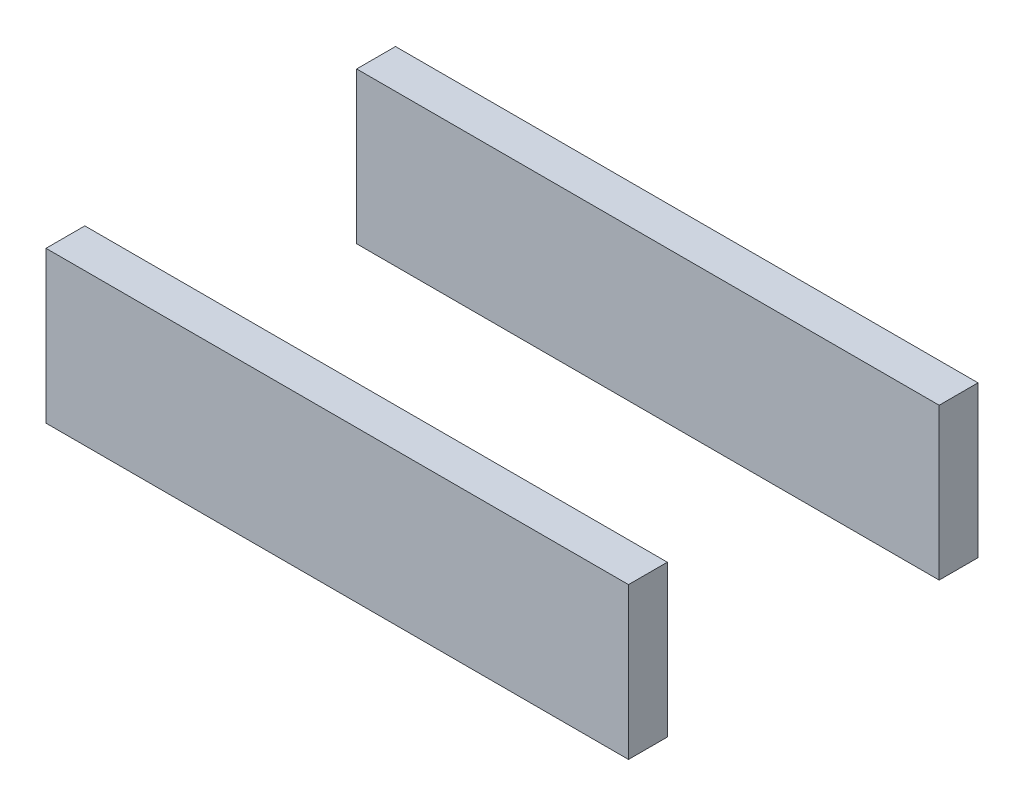
ISO-10303-21;
HEADER;
FILE_DESCRIPTION(('STEP AP214'),'2;1');
FILE_NAME('part.step','',(''),(''),'','','');
FILE_SCHEMA(('AUTOMOTIVE_DESIGN { 1 0 10303 214 1 1 1 1 }'));
ENDSEC;
DATA;
#1=APPLICATION_CONTEXT('core data for automotive mechanical design processes');
#2=APPLICATION_PROTOCOL_DEFINITION('international standard','automotive_design',2000,#1);
#3=PRODUCT_CONTEXT('',#1,'mechanical');
#4=PRODUCT('Part','Part','',(#3));
#5=PRODUCT_RELATED_PRODUCT_CATEGORY('part','',(#4));
#6=PRODUCT_DEFINITION_FORMATION('','',#4);
#7=PRODUCT_DEFINITION_CONTEXT('part definition',#1,'design');
#8=PRODUCT_DEFINITION('design','',#6,#7);
#9=PRODUCT_DEFINITION_SHAPE('','',#8);
#10=(LENGTH_UNIT() NAMED_UNIT(*) SI_UNIT(.MILLI.,.METRE.));
#11=(NAMED_UNIT(*) PLANE_ANGLE_UNIT() SI_UNIT($,.RADIAN.));
#12=(NAMED_UNIT(*) SI_UNIT($,.STERADIAN.) SOLID_ANGLE_UNIT());
#13=UNCERTAINTY_MEASURE_WITH_UNIT(LENGTH_MEASURE(1.E-05),#10,'distance_accuracy_value','');
#14=(GEOMETRIC_REPRESENTATION_CONTEXT(3) GLOBAL_UNCERTAINTY_ASSIGNED_CONTEXT((#13)) GLOBAL_UNIT_ASSIGNED_CONTEXT((#10,
#11,#12)) REPRESENTATION_CONTEXT('',''));
#15=CARTESIAN_POINT('',(0.,0.,0.));
#16=DIRECTION('',(0.,0.,1.));
#17=DIRECTION('',(1.,0.,0.));
#18=AXIS2_PLACEMENT_3D('',#15,#16,#17);
#19=CARTESIAN_POINT('',(-25.5693333333333,9.906,-17.018));
#20=DIRECTION('',(1.,0.,0.));
#21=DIRECTION('',(0.,0.,-1.));
#22=AXIS2_PLACEMENT_3D('',#19,#20,#21);
#23=PLANE('',#22);
#24=DIRECTION('',(0.,0.,1.));
#25=VECTOR('',#24,1.);
#26=CARTESIAN_POINT('',(-25.5693333333333,0.,-17.018));
#27=LINE('',#26,#25);
#28=CARTESIAN_POINT('',(-25.5693333333333,0.,-17.018));
#29=VERTEX_POINT('',#28);
#30=CARTESIAN_POINT('',(-25.5693333333333,0.,-14.478));
#31=VERTEX_POINT('',#30);
#32=EDGE_CURVE('E106',#29,#31,#27,.T.);
#33=ORIENTED_EDGE('',*,*,#32,.T.);
#34=DIRECTION('',(0.,-1.,0.));
#35=VECTOR('',#34,1.);
#36=CARTESIAN_POINT('',(-25.5693333333333,9.906,-14.478));
#37=LINE('',#36,#35);
#38=CARTESIAN_POINT('',(-25.5693333333333,9.906,-14.478));
#39=VERTEX_POINT('',#38);
#40=EDGE_CURVE('E12',#39,#31,#37,.T.);
#41=ORIENTED_EDGE('',*,*,#40,.F.);
#42=DIRECTION('',(0.,0.,1.));
#43=VECTOR('',#42,1.);
#44=CARTESIAN_POINT('',(-25.5693333333333,9.906,-17.018));
#45=LINE('',#44,#43);
#46=CARTESIAN_POINT('',(-25.5693333333333,9.906,-17.018));
#47=VERTEX_POINT('',#46);
#48=EDGE_CURVE('E94',#47,#39,#45,.T.);
#49=ORIENTED_EDGE('',*,*,#48,.F.);
#50=DIRECTION('',(0.,-1.,0.));
#51=VECTOR('',#50,1.);
#52=CARTESIAN_POINT('',(-25.5693333333333,9.906,-17.018));
#53=LINE('',#52,#51);
#54=EDGE_CURVE('E102',#47,#29,#53,.T.);
#55=ORIENTED_EDGE('',*,*,#54,.T.);
#56=EDGE_LOOP('',(#33,#41,#49,#55));
#57=FACE_BOUND('',#56,.T.);
#58=ADVANCED_FACE('F43',(#57),#23,.F.);
#59=CARTESIAN_POINT('',(-25.5693333333333,9.906,-14.478));
#60=DIRECTION('',(0.,0.,-1.));
#61=DIRECTION('',(-1.,0.,0.));
#62=AXIS2_PLACEMENT_3D('',#59,#60,#61);
#63=PLANE('',#62);
#64=DIRECTION('',(1.,0.,0.));
#65=VECTOR('',#64,1.);
#66=CARTESIAN_POINT('',(-25.5693333333333,0.,-14.478));
#67=LINE('',#66,#65);
#68=CARTESIAN_POINT('',(12.5306666666667,0.,-14.478));
#69=VERTEX_POINT('',#68);
#70=EDGE_CURVE('E98',#31,#69,#67,.T.);
#71=ORIENTED_EDGE('',*,*,#70,.T.);
#72=DIRECTION('',(0.,-1.,0.));
#73=VECTOR('',#72,1.);
#74=CARTESIAN_POINT('',(12.5306666666667,9.906,-14.478));
#75=LINE('',#74,#73);
#76=CARTESIAN_POINT('',(12.5306666666667,9.906,-14.478));
#77=VERTEX_POINT('',#76);
#78=EDGE_CURVE('E51',#77,#69,#75,.T.);
#79=ORIENTED_EDGE('',*,*,#78,.F.);
#80=DIRECTION('',(1.,0.,0.));
#81=VECTOR('',#80,1.);
#82=CARTESIAN_POINT('',(-25.5693333333333,9.906,-14.478));
#83=LINE('',#82,#81);
#84=EDGE_CURVE('E89',#39,#77,#83,.T.);
#85=ORIENTED_EDGE('',*,*,#84,.F.);
#86=ORIENTED_EDGE('',*,*,#40,.T.);
#87=EDGE_LOOP('',(#71,#79,#85,#86));
#88=FACE_BOUND('',#87,.T.);
#89=ADVANCED_FACE('F97',(#88),#63,.F.);
#90=CARTESIAN_POINT('',(12.5306666666667,9.906,-17.018));
#91=DIRECTION('',(-1.,0.,0.));
#92=DIRECTION('',(0.,0.,1.));
#93=AXIS2_PLACEMENT_3D('',#90,#91,#92);
#94=PLANE('',#93);
#95=DIRECTION('',(0.,0.,-1.));
#96=VECTOR('',#95,1.);
#97=CARTESIAN_POINT('',(12.5306666666667,0.,-17.018));
#98=LINE('',#97,#96);
#99=CARTESIAN_POINT('',(12.5306666666667,0.,-17.018));
#100=VERTEX_POINT('',#99);
#101=EDGE_CURVE('E76',#69,#100,#98,.T.);
#102=ORIENTED_EDGE('',*,*,#101,.T.);
#103=DIRECTION('',(0.,-1.,0.));
#104=VECTOR('',#103,1.);
#105=CARTESIAN_POINT('',(12.5306666666667,9.906,-17.018));
#106=LINE('',#105,#104);
#107=CARTESIAN_POINT('',(12.5306666666667,9.906,-17.018));
#108=VERTEX_POINT('',#107);
#109=EDGE_CURVE('E99',#108,#100,#106,.T.);
#110=ORIENTED_EDGE('',*,*,#109,.F.);
#111=DIRECTION('',(0.,0.,-1.));
#112=VECTOR('',#111,1.);
#113=CARTESIAN_POINT('',(12.5306666666667,9.906,-17.018));
#114=LINE('',#113,#112);
#115=EDGE_CURVE('E92',#77,#108,#114,.T.);
#116=ORIENTED_EDGE('',*,*,#115,.F.);
#117=ORIENTED_EDGE('',*,*,#78,.T.);
#118=EDGE_LOOP('',(#102,#110,#116,#117));
#119=FACE_BOUND('',#118,.T.);
#120=ADVANCED_FACE('F100',(#119),#94,.F.);
#121=CARTESIAN_POINT('',(-25.5693333333333,9.906,-17.018));
#122=DIRECTION('',(0.,0.,1.));
#123=DIRECTION('',(1.,0.,0.));
#124=AXIS2_PLACEMENT_3D('',#121,#122,#123);
#125=PLANE('',#124);
#126=DIRECTION('',(-1.,0.,0.));
#127=VECTOR('',#126,1.);
#128=CARTESIAN_POINT('',(-25.5693333333333,0.,-17.018));
#129=LINE('',#128,#127);
#130=EDGE_CURVE('E82',#100,#29,#129,.T.);
#131=ORIENTED_EDGE('',*,*,#130,.T.);
#132=ORIENTED_EDGE('',*,*,#54,.F.);
#133=DIRECTION('',(-1.,0.,0.));
#134=VECTOR('',#133,1.);
#135=CARTESIAN_POINT('',(-25.5693333333333,9.906,-17.018));
#136=LINE('',#135,#134);
#137=EDGE_CURVE('E59',#108,#47,#136,.T.);
#138=ORIENTED_EDGE('',*,*,#137,.F.);
#139=ORIENTED_EDGE('',*,*,#109,.T.);
#140=EDGE_LOOP('',(#131,#132,#138,#139));
#141=FACE_BOUND('',#140,.T.);
#142=ADVANCED_FACE('F113',(#141),#125,.F.);
#143=CARTESIAN_POINT('',(0.,9.906,0.));
#144=DIRECTION('',(0.,1.,0.));
#145=DIRECTION('',(0.,0.,1.));
#146=AXIS2_PLACEMENT_3D('',#143,#144,#145);
#147=PLANE('',#146);
#148=ORIENTED_EDGE('',*,*,#48,.T.);
#149=ORIENTED_EDGE('',*,*,#84,.T.);
#150=ORIENTED_EDGE('',*,*,#115,.T.);
#151=ORIENTED_EDGE('',*,*,#137,.T.);
#152=EDGE_LOOP('',(#148,#149,#150,#151));
#153=FACE_BOUND('',#152,.T.);
#154=ADVANCED_FACE('F90',(#153),#147,.T.);
#155=CARTESIAN_POINT('',(0.,0.,0.));
#156=DIRECTION('',(0.,1.,0.));
#157=DIRECTION('',(0.,0.,1.));
#158=AXIS2_PLACEMENT_3D('',#155,#156,#157);
#159=PLANE('',#158);
#160=ORIENTED_EDGE('',*,*,#32,.F.);
#161=ORIENTED_EDGE('',*,*,#130,.F.);
#162=ORIENTED_EDGE('',*,*,#101,.F.);
#163=ORIENTED_EDGE('',*,*,#70,.F.);
#164=EDGE_LOOP('',(#160,#161,#162,#163));
#165=FACE_BOUND('',#164,.T.);
#166=ADVANCED_FACE('F116',(#165),#159,.F.);
#167=CLOSED_SHELL('',(#58,#89,#120,#142,#154,#166));
#168=MANIFOLD_SOLID_BREP('B2',#167);
#169=CARTESIAN_POINT('',(-25.5693333333333,9.906,-37.338));
#170=DIRECTION('',(1.,0.,0.));
#171=DIRECTION('',(0.,0.,-1.));
#172=AXIS2_PLACEMENT_3D('',#169,#170,#171);
#173=PLANE('',#172);
#174=DIRECTION('',(0.,0.,1.));
#175=VECTOR('',#174,1.);
#176=CARTESIAN_POINT('',(-25.5693333333333,0.,-37.338));
#177=LINE('',#176,#175);
#178=CARTESIAN_POINT('',(-25.5693333333333,0.,-37.338));
#179=VERTEX_POINT('',#178);
#180=CARTESIAN_POINT('',(-25.5693333333333,0.,-34.798));
#181=VERTEX_POINT('',#180);
#182=EDGE_CURVE('E230',#179,#181,#177,.T.);
#183=ORIENTED_EDGE('',*,*,#182,.T.);
#184=DIRECTION('',(0.,-1.,0.));
#185=VECTOR('',#184,1.);
#186=CARTESIAN_POINT('',(-25.5693333333333,9.906,-34.798));
#187=LINE('',#186,#185);
#188=CARTESIAN_POINT('',(-25.5693333333333,9.906,-34.798));
#189=VERTEX_POINT('',#188);
#190=EDGE_CURVE('E41',#189,#181,#187,.T.);
#191=ORIENTED_EDGE('',*,*,#190,.F.);
#192=DIRECTION('',(0.,0.,1.));
#193=VECTOR('',#192,1.);
#194=CARTESIAN_POINT('',(-25.5693333333333,9.906,-37.338));
#195=LINE('',#194,#193);
#196=CARTESIAN_POINT('',(-25.5693333333333,9.906,-37.338));
#197=VERTEX_POINT('',#196);
#198=EDGE_CURVE('E218',#197,#189,#195,.T.);
#199=ORIENTED_EDGE('',*,*,#198,.F.);
#200=DIRECTION('',(0.,-1.,0.));
#201=VECTOR('',#200,1.);
#202=CARTESIAN_POINT('',(-25.5693333333333,9.906,-37.338));
#203=LINE('',#202,#201);
#204=EDGE_CURVE('E226',#197,#179,#203,.T.);
#205=ORIENTED_EDGE('',*,*,#204,.T.);
#206=EDGE_LOOP('',(#183,#191,#199,#205));
#207=FACE_BOUND('',#206,.T.);
#208=ADVANCED_FACE('F167',(#207),#173,.F.);
#209=CARTESIAN_POINT('',(-25.5693333333333,9.906,-34.798));
#210=DIRECTION('',(0.,0.,-1.));
#211=DIRECTION('',(-1.,0.,0.));
#212=AXIS2_PLACEMENT_3D('',#209,#210,#211);
#213=PLANE('',#212);
#214=DIRECTION('',(1.,0.,0.));
#215=VECTOR('',#214,1.);
#216=CARTESIAN_POINT('',(-25.5693333333333,0.,-34.798));
#217=LINE('',#216,#215);
#218=CARTESIAN_POINT('',(12.5306666666667,0.,-34.798));
#219=VERTEX_POINT('',#218);
#220=EDGE_CURVE('E222',#181,#219,#217,.T.);
#221=ORIENTED_EDGE('',*,*,#220,.T.);
#222=DIRECTION('',(0.,-1.,0.));
#223=VECTOR('',#222,1.);
#224=CARTESIAN_POINT('',(12.5306666666667,9.906,-34.798));
#225=LINE('',#224,#223);
#226=CARTESIAN_POINT('',(12.5306666666667,9.906,-34.798));
#227=VERTEX_POINT('',#226);
#228=EDGE_CURVE('E175',#227,#219,#225,.T.);
#229=ORIENTED_EDGE('',*,*,#228,.F.);
#230=DIRECTION('',(1.,0.,0.));
#231=VECTOR('',#230,1.);
#232=CARTESIAN_POINT('',(-25.5693333333333,9.906,-34.798));
#233=LINE('',#232,#231);
#234=EDGE_CURVE('E213',#189,#227,#233,.T.);
#235=ORIENTED_EDGE('',*,*,#234,.F.);
#236=ORIENTED_EDGE('',*,*,#190,.T.);
#237=EDGE_LOOP('',(#221,#229,#235,#236));
#238=FACE_BOUND('',#237,.T.);
#239=ADVANCED_FACE('F221',(#238),#213,.F.);
#240=CARTESIAN_POINT('',(12.5306666666667,9.906,-37.338));
#241=DIRECTION('',(-1.,0.,0.));
#242=DIRECTION('',(0.,0.,1.));
#243=AXIS2_PLACEMENT_3D('',#240,#241,#242);
#244=PLANE('',#243);
#245=DIRECTION('',(0.,0.,-1.));
#246=VECTOR('',#245,1.);
#247=CARTESIAN_POINT('',(12.5306666666667,0.,-37.338));
#248=LINE('',#247,#246);
#249=CARTESIAN_POINT('',(12.5306666666667,0.,-37.338));
#250=VERTEX_POINT('',#249);
#251=EDGE_CURVE('E200',#219,#250,#248,.T.);
#252=ORIENTED_EDGE('',*,*,#251,.T.);
#253=DIRECTION('',(0.,-1.,0.));
#254=VECTOR('',#253,1.);
#255=CARTESIAN_POINT('',(12.5306666666667,9.906,-37.338));
#256=LINE('',#255,#254);
#257=CARTESIAN_POINT('',(12.5306666666667,9.906,-37.338));
#258=VERTEX_POINT('',#257);
#259=EDGE_CURVE('E223',#258,#250,#256,.T.);
#260=ORIENTED_EDGE('',*,*,#259,.F.);
#261=DIRECTION('',(0.,0.,-1.));
#262=VECTOR('',#261,1.);
#263=CARTESIAN_POINT('',(12.5306666666667,9.906,-37.338));
#264=LINE('',#263,#262);
#265=EDGE_CURVE('E216',#227,#258,#264,.T.);
#266=ORIENTED_EDGE('',*,*,#265,.F.);
#267=ORIENTED_EDGE('',*,*,#228,.T.);
#268=EDGE_LOOP('',(#252,#260,#266,#267));
#269=FACE_BOUND('',#268,.T.);
#270=ADVANCED_FACE('F224',(#269),#244,.F.);
#271=CARTESIAN_POINT('',(-25.5693333333333,9.906,-37.338));
#272=DIRECTION('',(0.,0.,1.));
#273=DIRECTION('',(1.,0.,0.));
#274=AXIS2_PLACEMENT_3D('',#271,#272,#273);
#275=PLANE('',#274);
#276=DIRECTION('',(-1.,0.,0.));
#277=VECTOR('',#276,1.);
#278=CARTESIAN_POINT('',(-25.5693333333333,0.,-37.338));
#279=LINE('',#278,#277);
#280=EDGE_CURVE('E206',#250,#179,#279,.T.);
#281=ORIENTED_EDGE('',*,*,#280,.T.);
#282=ORIENTED_EDGE('',*,*,#204,.F.);
#283=DIRECTION('',(-1.,0.,0.));
#284=VECTOR('',#283,1.);
#285=CARTESIAN_POINT('',(-25.5693333333333,9.906,-37.338));
#286=LINE('',#285,#284);
#287=EDGE_CURVE('E183',#258,#197,#286,.T.);
#288=ORIENTED_EDGE('',*,*,#287,.F.);
#289=ORIENTED_EDGE('',*,*,#259,.T.);
#290=EDGE_LOOP('',(#281,#282,#288,#289));
#291=FACE_BOUND('',#290,.T.);
#292=ADVANCED_FACE('F237',(#291),#275,.F.);
#293=CARTESIAN_POINT('',(0.,9.906,0.));
#294=DIRECTION('',(0.,1.,0.));
#295=DIRECTION('',(0.,0.,1.));
#296=AXIS2_PLACEMENT_3D('',#293,#294,#295);
#297=PLANE('',#296);
#298=ORIENTED_EDGE('',*,*,#198,.T.);
#299=ORIENTED_EDGE('',*,*,#234,.T.);
#300=ORIENTED_EDGE('',*,*,#265,.T.);
#301=ORIENTED_EDGE('',*,*,#287,.T.);
#302=EDGE_LOOP('',(#298,#299,#300,#301));
#303=FACE_BOUND('',#302,.T.);
#304=ADVANCED_FACE('F214',(#303),#297,.T.);
#305=CARTESIAN_POINT('',(0.,0.,0.));
#306=DIRECTION('',(0.,1.,0.));
#307=DIRECTION('',(0.,0.,1.));
#308=AXIS2_PLACEMENT_3D('',#305,#306,#307);
#309=PLANE('',#308);
#310=ORIENTED_EDGE('',*,*,#182,.F.);
#311=ORIENTED_EDGE('',*,*,#280,.F.);
#312=ORIENTED_EDGE('',*,*,#251,.F.);
#313=ORIENTED_EDGE('',*,*,#220,.F.);
#314=EDGE_LOOP('',(#310,#311,#312,#313));
#315=FACE_BOUND('',#314,.T.);
#316=ADVANCED_FACE('F240',(#315),#309,.F.);
#317=CLOSED_SHELL('',(#208,#239,#270,#292,#304,#316));
#318=MANIFOLD_SOLID_BREP('B6',#317);
#319=ADVANCED_BREP_SHAPE_REPRESENTATION('',(#18,#168,#318),#14);
#320=SHAPE_DEFINITION_REPRESENTATION(#9,#319);
ENDSEC;
END-ISO-10303-21;
